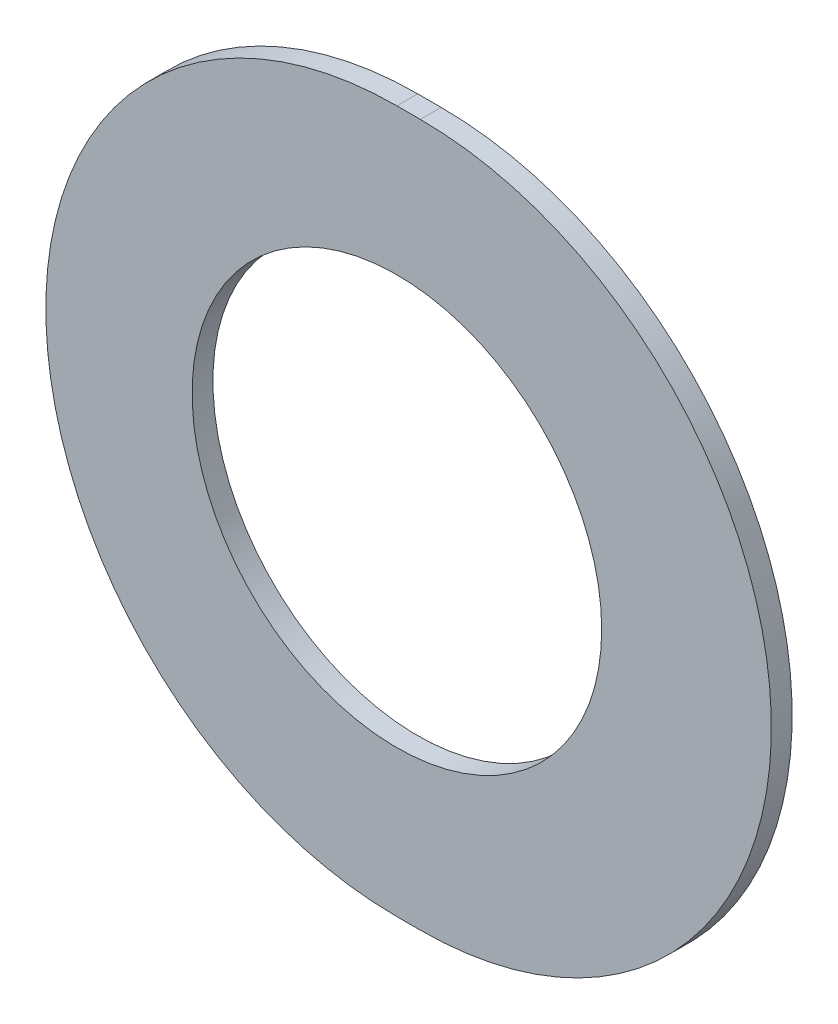
ISO-10303-21;
HEADER;
FILE_DESCRIPTION(('STEP AP214'),'2;1');
FILE_NAME('part.step','',(''),(''),'','','');
FILE_SCHEMA(('AUTOMOTIVE_DESIGN { 1 0 10303 214 1 1 1 1 }'));
ENDSEC;
DATA;
#1=APPLICATION_CONTEXT('core data for automotive mechanical design processes');
#2=APPLICATION_PROTOCOL_DEFINITION('international standard','automotive_design',2000,#1);
#3=PRODUCT_CONTEXT('',#1,'mechanical');
#4=PRODUCT('Part','Part','',(#3));
#5=PRODUCT_RELATED_PRODUCT_CATEGORY('part','',(#4));
#6=PRODUCT_DEFINITION_FORMATION('','',#4);
#7=PRODUCT_DEFINITION_CONTEXT('part definition',#1,'design');
#8=PRODUCT_DEFINITION('design','',#6,#7);
#9=PRODUCT_DEFINITION_SHAPE('','',#8);
#10=(LENGTH_UNIT() NAMED_UNIT(*) SI_UNIT(.MILLI.,.METRE.));
#11=(NAMED_UNIT(*) PLANE_ANGLE_UNIT() SI_UNIT($,.RADIAN.));
#12=(NAMED_UNIT(*) SI_UNIT($,.STERADIAN.) SOLID_ANGLE_UNIT());
#13=UNCERTAINTY_MEASURE_WITH_UNIT(LENGTH_MEASURE(1.E-05),#10,'distance_accuracy_value','');
#14=(GEOMETRIC_REPRESENTATION_CONTEXT(3) GLOBAL_UNCERTAINTY_ASSIGNED_CONTEXT((#13)) GLOBAL_UNIT_ASSIGNED_CONTEXT((#10,
#11,#12)) REPRESENTATION_CONTEXT('',''));
#15=CARTESIAN_POINT('',(0.,0.,0.));
#16=DIRECTION('',(0.,0.,1.));
#17=DIRECTION('',(1.,0.,0.));
#18=AXIS2_PLACEMENT_3D('',#15,#16,#17);
#19=CARTESIAN_POINT('',(38.4000248,45.4399904,0.));
#20=DIRECTION('',(0.,1.,0.));
#21=DIRECTION('',(1.,0.,0.));
#22=AXIS2_PLACEMENT_3D('',#19,#20,#21);
#23=PLANE('',#22);
#24=DIRECTION('',(1.,0.,0.));
#25=VECTOR('',#24,1.);
#26=CARTESIAN_POINT('',(38.4000248,45.4399904,0.03556));
#27=LINE('',#26,#25);
#28=CARTESIAN_POINT('',(38.4000248,45.4399904,0.03556));
#29=VERTEX_POINT('',#28);
#30=CARTESIAN_POINT('',(38.43998916,45.4399904,0.03556));
#31=VERTEX_POINT('',#30);
#32=EDGE_CURVE('E11',#29,#31,#27,.T.);
#33=ORIENTED_EDGE('',*,*,#32,.F.);
#34=DIRECTION('',(0.,0.,1.));
#35=VECTOR('',#34,1.);
#36=CARTESIAN_POINT('',(38.4000248,45.4399904,0.));
#37=LINE('',#36,#35);
#38=CARTESIAN_POINT('',(38.4000248,45.4399904,0.));
#39=VERTEX_POINT('',#38);
#40=EDGE_CURVE('E24',#39,#29,#37,.T.);
#41=ORIENTED_EDGE('',*,*,#40,.F.);
#42=DIRECTION('',(1.,0.,0.));
#43=VECTOR('',#42,1.);
#44=CARTESIAN_POINT('',(38.4000248,45.4399904,0.));
#45=LINE('',#44,#43);
#46=CARTESIAN_POINT('',(38.43998916,45.4399904,0.));
#47=VERTEX_POINT('',#46);
#48=EDGE_CURVE('E96',#39,#47,#45,.T.);
#49=ORIENTED_EDGE('',*,*,#48,.T.);
#50=DIRECTION('',(0.,0.,1.));
#51=VECTOR('',#50,1.);
#52=CARTESIAN_POINT('',(38.43998916,45.4399904,0.));
#53=LINE('',#52,#51);
#54=EDGE_CURVE('E37',#47,#31,#53,.T.);
#55=ORIENTED_EDGE('',*,*,#54,.T.);
#56=EDGE_LOOP('',(#33,#41,#49,#55));
#57=FACE_BOUND('',#56,.T.);
#58=ADVANCED_FACE('F17',(#57),#23,.F.);
#59=CARTESIAN_POINT('',(38.4000248,46.0399892,0.));
#60=DIRECTION('',(0.,0.,-1.));
#61=DIRECTION('',(0.,1.,0.));
#62=AXIS2_PLACEMENT_3D('',#59,#60,#61);
#63=CYLINDRICAL_SURFACE('',#62,0.599998799999999);
#64=CARTESIAN_POINT('',(38.4000248,46.0399892,0.03556));
#65=DIRECTION('',(0.,0.,1.));
#66=DIRECTION('',(0.,1.,0.));
#67=AXIS2_PLACEMENT_3D('',#64,#65,#66);
#68=CIRCLE('',#67,0.599998799999999);
#69=CARTESIAN_POINT('',(38.4000248,46.639988,0.03556));
#70=VERTEX_POINT('',#69);
#71=EDGE_CURVE('E92',#70,#29,#68,.T.);
#72=ORIENTED_EDGE('',*,*,#71,.F.);
#73=DIRECTION('',(0.,0.,1.));
#74=VECTOR('',#73,1.);
#75=CARTESIAN_POINT('',(38.4000248,46.639988,0.));
#76=LINE('',#75,#74);
#77=CARTESIAN_POINT('',(38.4000248,46.639988,0.));
#78=VERTEX_POINT('',#77);
#79=EDGE_CURVE('E90',#78,#70,#76,.T.);
#80=ORIENTED_EDGE('',*,*,#79,.F.);
#81=CARTESIAN_POINT('',(38.4000248,46.0399892,0.));
#82=DIRECTION('',(0.,0.,1.));
#83=DIRECTION('',(0.,1.,0.));
#84=AXIS2_PLACEMENT_3D('',#81,#82,#83);
#85=CIRCLE('',#84,0.599998799999999);
#86=EDGE_CURVE('E88',#78,#39,#85,.T.);
#87=ORIENTED_EDGE('',*,*,#86,.T.);
#88=ORIENTED_EDGE('',*,*,#40,.T.);
#89=EDGE_LOOP('',(#72,#80,#87,#88));
#90=FACE_BOUND('',#89,.T.);
#91=ADVANCED_FACE('F111',(#90),#63,.T.);
#92=CARTESIAN_POINT('',(38.43998916,46.0399892,0.));
#93=DIRECTION('',(0.,0.,-1.));
#94=DIRECTION('',(0.,-1.,0.));
#95=AXIS2_PLACEMENT_3D('',#92,#93,#94);
#96=CYLINDRICAL_SURFACE('',#95,0.599998799999999);
#97=CARTESIAN_POINT('',(38.43998916,46.0399892,0.03556));
#98=DIRECTION('',(0.,0.,1.));
#99=DIRECTION('',(0.,-1.,0.));
#100=AXIS2_PLACEMENT_3D('',#97,#98,#99);
#101=CIRCLE('',#100,0.599998799999999);
#102=CARTESIAN_POINT('',(38.43998916,46.639988,0.03556));
#103=VERTEX_POINT('',#102);
#104=EDGE_CURVE('E85',#31,#103,#101,.T.);
#105=ORIENTED_EDGE('',*,*,#104,.F.);
#106=ORIENTED_EDGE('',*,*,#54,.F.);
#107=CARTESIAN_POINT('',(38.43998916,46.0399892,0.));
#108=DIRECTION('',(0.,0.,1.));
#109=DIRECTION('',(0.,-1.,0.));
#110=AXIS2_PLACEMENT_3D('',#107,#108,#109);
#111=CIRCLE('',#110,0.599998799999999);
#112=CARTESIAN_POINT('',(38.43998916,46.639988,0.));
#113=VERTEX_POINT('',#112);
#114=EDGE_CURVE('E82',#47,#113,#111,.T.);
#115=ORIENTED_EDGE('',*,*,#114,.T.);
#116=DIRECTION('',(0.,0.,1.));
#117=VECTOR('',#116,1.);
#118=CARTESIAN_POINT('',(38.43998916,46.639988,0.));
#119=LINE('',#118,#117);
#120=EDGE_CURVE('E80',#113,#103,#119,.T.);
#121=ORIENTED_EDGE('',*,*,#120,.T.);
#122=EDGE_LOOP('',(#105,#106,#115,#121));
#123=FACE_BOUND('',#122,.T.);
#124=ADVANCED_FACE('F104',(#123),#96,.T.);
#125=CARTESIAN_POINT('',(38.43998916,46.639988,0.));
#126=DIRECTION('',(0.,-1.,0.));
#127=DIRECTION('',(-1.,0.,0.));
#128=AXIS2_PLACEMENT_3D('',#125,#126,#127);
#129=PLANE('',#128);
#130=DIRECTION('',(-1.,0.,0.));
#131=VECTOR('',#130,1.);
#132=CARTESIAN_POINT('',(38.43998916,46.639988,0.03556));
#133=LINE('',#132,#131);
#134=EDGE_CURVE('E77',#103,#70,#133,.T.);
#135=ORIENTED_EDGE('',*,*,#134,.F.);
#136=ORIENTED_EDGE('',*,*,#120,.F.);
#137=DIRECTION('',(-1.,0.,0.));
#138=VECTOR('',#137,1.);
#139=CARTESIAN_POINT('',(38.43998916,46.639988,0.));
#140=LINE('',#139,#138);
#141=EDGE_CURVE('E68',#113,#78,#140,.T.);
#142=ORIENTED_EDGE('',*,*,#141,.T.);
#143=ORIENTED_EDGE('',*,*,#79,.T.);
#144=EDGE_LOOP('',(#135,#136,#142,#143));
#145=FACE_BOUND('',#144,.T.);
#146=ADVANCED_FACE('F110',(#145),#129,.F.);
#147=CARTESIAN_POINT('',(38.4000248,46.0399892,0.));
#148=DIRECTION('',(0.,0.,-1.));
#149=DIRECTION('',(1.,0.,0.));
#150=AXIS2_PLACEMENT_3D('',#147,#148,#149);
#151=CYLINDRICAL_SURFACE('',#150,0.3499993);
#152=DIRECTION('',(0.,0.,1.));
#153=VECTOR('',#152,1.);
#154=CARTESIAN_POINT('',(38.7500241,46.0399892,0.));
#155=LINE('',#154,#153);
#156=CARTESIAN_POINT('',(38.7500241,46.0399892,0.));
#157=VERTEX_POINT('',#156);
#158=CARTESIAN_POINT('',(38.7500241,46.0399892,0.03556));
#159=VERTEX_POINT('',#158);
#160=EDGE_CURVE('E62',#157,#159,#155,.T.);
#161=ORIENTED_EDGE('',*,*,#160,.T.);
#162=CARTESIAN_POINT('',(38.4000248,46.0399892,0.03556));
#163=DIRECTION('',(0.,0.,1.));
#164=DIRECTION('',(1.,0.,0.));
#165=AXIS2_PLACEMENT_3D('',#162,#163,#164);
#166=CIRCLE('',#165,0.3499993);
#167=EDGE_CURVE('E67',#159,#159,#166,.T.);
#168=ORIENTED_EDGE('',*,*,#167,.T.);
#169=ORIENTED_EDGE('',*,*,#160,.F.);
#170=CARTESIAN_POINT('',(38.4000248,46.0399892,0.));
#171=DIRECTION('',(0.,0.,1.));
#172=DIRECTION('',(1.,0.,0.));
#173=AXIS2_PLACEMENT_3D('',#170,#171,#172);
#174=CIRCLE('',#173,0.3499993);
#175=EDGE_CURVE('E65',#157,#157,#174,.T.);
#176=ORIENTED_EDGE('',*,*,#175,.F.);
#177=EDGE_LOOP('',(#161,#168,#169,#176));
#178=FACE_BOUND('',#177,.T.);
#179=ADVANCED_FACE('F64',(#178),#151,.F.);
#180=CARTESIAN_POINT('',(38.4000248,45.4399904,0.));
#181=DIRECTION('',(0.,0.,-1.));
#182=DIRECTION('',(-1.,0.,0.));
#183=AXIS2_PLACEMENT_3D('',#180,#181,#182);
#184=PLANE('',#183);
#185=ORIENTED_EDGE('',*,*,#48,.F.);
#186=ORIENTED_EDGE('',*,*,#86,.F.);
#187=ORIENTED_EDGE('',*,*,#141,.F.);
#188=ORIENTED_EDGE('',*,*,#114,.F.);
#189=EDGE_LOOP('',(#185,#186,#187,#188));
#190=FACE_BOUND('',#189,.T.);
#191=ORIENTED_EDGE('',*,*,#175,.T.);
#192=EDGE_LOOP('',(#191));
#193=FACE_BOUND('',#192,.T.);
#194=ADVANCED_FACE('F71',(#190,#193),#184,.T.);
#195=CARTESIAN_POINT('',(38.4000248,45.4399904,0.03556));
#196=DIRECTION('',(0.,0.,-1.));
#197=DIRECTION('',(-1.,0.,0.));
#198=AXIS2_PLACEMENT_3D('',#195,#196,#197);
#199=PLANE('',#198);
#200=ORIENTED_EDGE('',*,*,#134,.T.);
#201=ORIENTED_EDGE('',*,*,#71,.T.);
#202=ORIENTED_EDGE('',*,*,#32,.T.);
#203=ORIENTED_EDGE('',*,*,#104,.T.);
#204=EDGE_LOOP('',(#200,#201,#202,#203));
#205=FACE_BOUND('',#204,.T.);
#206=ORIENTED_EDGE('',*,*,#167,.F.);
#207=EDGE_LOOP('',(#206));
#208=FACE_BOUND('',#207,.T.);
#209=ADVANCED_FACE('F107',(#205,#208),#199,.F.);
#210=CLOSED_SHELL('',(#58,#91,#124,#146,#179,#194,#209));
#211=MANIFOLD_SOLID_BREP('B1',#210);
#212=ADVANCED_BREP_SHAPE_REPRESENTATION('',(#18,#211),#14);
#213=SHAPE_DEFINITION_REPRESENTATION(#9,#212);
ENDSEC;
END-ISO-10303-21;
